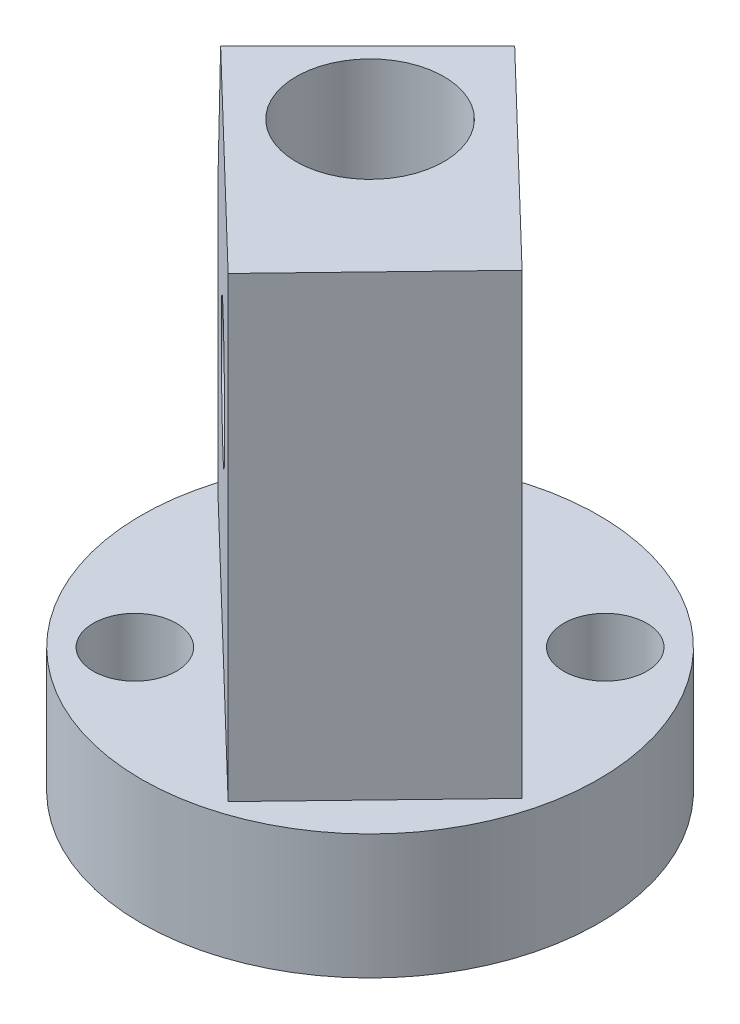
ISO-10303-21;
HEADER;
FILE_DESCRIPTION(('STEP AP214'),'2;1');
FILE_NAME('part.step','',(''),(''),'','','');
FILE_SCHEMA(('AUTOMOTIVE_DESIGN { 1 0 10303 214 1 1 1 1 }'));
ENDSEC;
DATA;
#1=APPLICATION_CONTEXT('core data for automotive mechanical design processes');
#2=APPLICATION_PROTOCOL_DEFINITION('international standard','automotive_design',2000,#1);
#3=PRODUCT_CONTEXT('',#1,'mechanical');
#4=PRODUCT('Part','Part','',(#3));
#5=PRODUCT_RELATED_PRODUCT_CATEGORY('part','',(#4));
#6=PRODUCT_DEFINITION_FORMATION('','',#4);
#7=PRODUCT_DEFINITION_CONTEXT('part definition',#1,'design');
#8=PRODUCT_DEFINITION('design','',#6,#7);
#9=PRODUCT_DEFINITION_SHAPE('','',#8);
#10=(LENGTH_UNIT() NAMED_UNIT(*) SI_UNIT(.MILLI.,.METRE.));
#11=(NAMED_UNIT(*) PLANE_ANGLE_UNIT() SI_UNIT($,.RADIAN.));
#12=(NAMED_UNIT(*) SI_UNIT($,.STERADIAN.) SOLID_ANGLE_UNIT());
#13=UNCERTAINTY_MEASURE_WITH_UNIT(LENGTH_MEASURE(1.E-05),#10,'distance_accuracy_value','');
#14=(GEOMETRIC_REPRESENTATION_CONTEXT(3) GLOBAL_UNCERTAINTY_ASSIGNED_CONTEXT((#13)) GLOBAL_UNIT_ASSIGNED_CONTEXT((#10,
#11,#12)) REPRESENTATION_CONTEXT('',''));
#15=CARTESIAN_POINT('',(0.,0.,0.));
#16=DIRECTION('',(0.,0.,1.));
#17=DIRECTION('',(1.,0.,0.));
#18=AXIS2_PLACEMENT_3D('',#15,#16,#17);
#19=CARTESIAN_POINT('',(9.95156463020634,6.,2.63938655956761));
#20=DIRECTION('',(-0.720444800698294,0.,-0.69351228478434));
#21=DIRECTION('',(-0.69351228478434,0.,0.720444800698294));
#22=AXIS2_PLACEMENT_3D('',#19,#20,#21);
#23=PLANE('',#22);
#24=DIRECTION('',(0.69351228478434,0.,-0.720444800698294));
#25=VECTOR('',#24,1.);
#26=CARTESIAN_POINT('',(6.48400320628464,28.,6.24161056305907));
#27=LINE('',#26,#25);
#28=CARTESIAN_POINT('',(3.01644178236294,28.,9.84383456655053));
#29=VERTEX_POINT('',#28);
#30=CARTESIAN_POINT('',(9.95156463020634,28.,2.63938655956761));
#31=VERTEX_POINT('',#30);
#32=EDGE_CURVE('E10',#29,#31,#27,.T.);
#33=ORIENTED_EDGE('',*,*,#32,.F.);
#34=DIRECTION('',(0.,1.,0.));
#35=VECTOR('',#34,1.);
#36=CARTESIAN_POINT('',(3.01644178236294,17.,9.84383456655053));
#37=LINE('',#36,#35);
#38=CARTESIAN_POINT('',(3.01644178236294,6.,9.84383456655053));
#39=VERTEX_POINT('',#38);
#40=EDGE_CURVE('E26',#39,#29,#37,.T.);
#41=ORIENTED_EDGE('',*,*,#40,.F.);
#42=DIRECTION('',(0.69351228478434,0.,-0.720444800698294));
#43=VECTOR('',#42,1.);
#44=CARTESIAN_POINT('',(6.48400320628464,6.,6.24161056305907));
#45=LINE('',#44,#43);
#46=CARTESIAN_POINT('',(9.95156463020635,6.,2.6393865595676));
#47=VERTEX_POINT('',#46);
#48=EDGE_CURVE('E127',#39,#47,#45,.T.);
#49=ORIENTED_EDGE('',*,*,#48,.T.);
#50=DIRECTION('',(0.,1.,0.));
#51=VECTOR('',#50,1.);
#52=CARTESIAN_POINT('',(9.95156463020634,17.,2.63938655956761));
#53=LINE('',#52,#51);
#54=EDGE_CURVE('E35',#47,#31,#53,.T.);
#55=ORIENTED_EDGE('',*,*,#54,.T.);
#56=EDGE_LOOP('',(#33,#41,#49,#55));
#57=FACE_BOUND('',#56,.T.);
#58=ADVANCED_FACE('F16',(#57),#23,.F.);
#59=CARTESIAN_POINT('',(0.,3.,0.));
#60=DIRECTION('',(0.,1.,0.));
#61=DIRECTION('',(0.,0.,1.));
#62=AXIS2_PLACEMENT_3D('',#59,#60,#61);
#63=CYLINDRICAL_SURFACE('',#62,11.);
#64=CARTESIAN_POINT('',(0.,6.,0.));
#65=DIRECTION('',(0.,1.,0.));
#66=DIRECTION('',(0.,0.,1.));
#67=AXIS2_PLACEMENT_3D('',#64,#65,#66);
#68=CIRCLE('',#67,11.);
#69=CARTESIAN_POINT('',(0.,6.,11.));
#70=VERTEX_POINT('',#69);
#71=EDGE_CURVE('E150',#70,#70,#68,.T.);
#72=ORIENTED_EDGE('',*,*,#71,.F.);
#73=EDGE_LOOP('',(#72));
#74=FACE_BOUND('',#73,.T.);
#75=CARTESIAN_POINT('',(0.,0.,0.));
#76=DIRECTION('',(0.,1.,0.));
#77=DIRECTION('',(0.,0.,1.));
#78=AXIS2_PLACEMENT_3D('',#75,#76,#77);
#79=CIRCLE('',#78,11.);
#80=CARTESIAN_POINT('',(0.,0.,11.));
#81=VERTEX_POINT('',#80);
#82=EDGE_CURVE('E143',#81,#81,#79,.T.);
#83=ORIENTED_EDGE('',*,*,#82,.T.);
#84=EDGE_LOOP('',(#83));
#85=FACE_BOUND('',#84,.T.);
#86=ADVANCED_FACE('F178',(#74,#85),#63,.T.);
#87=CARTESIAN_POINT('',(0.,0.,0.));
#88=DIRECTION('',(0.,1.,0.));
#89=DIRECTION('',(0.,0.,1.));
#90=AXIS2_PLACEMENT_3D('',#87,#88,#89);
#91=PLANE('',#90);
#92=ORIENTED_EDGE('',*,*,#82,.F.);
#93=EDGE_LOOP('',(#92));
#94=FACE_BOUND('',#93,.T.);
#95=CARTESIAN_POINT('',(-5.65685424949238,0.,5.65685424949238));
#96=DIRECTION('',(0.,1.,0.));
#97=DIRECTION('',(0.,0.,1.));
#98=AXIS2_PLACEMENT_3D('',#95,#96,#97);
#99=CIRCLE('',#98,1.25);
#100=CARTESIAN_POINT('',(-5.65685424949238,0.,6.90685424949238));
#101=VERTEX_POINT('',#100);
#102=EDGE_CURVE('E131',#101,#101,#99,.T.);
#103=ORIENTED_EDGE('',*,*,#102,.T.);
#104=EDGE_LOOP('',(#103));
#105=FACE_BOUND('',#104,.T.);
#106=CARTESIAN_POINT('',(5.65685424949238,0.,-5.65685424949238));
#107=DIRECTION('',(0.,1.,0.));
#108=DIRECTION('',(0.,0.,1.));
#109=AXIS2_PLACEMENT_3D('',#106,#107,#108);
#110=CIRCLE('',#109,1.25);
#111=CARTESIAN_POINT('',(5.65685424949238,0.,-4.40685424949238));
#112=VERTEX_POINT('',#111);
#113=EDGE_CURVE('E140',#112,#112,#110,.T.);
#114=ORIENTED_EDGE('',*,*,#113,.T.);
#115=EDGE_LOOP('',(#114));
#116=FACE_BOUND('',#115,.T.);
#117=CARTESIAN_POINT('',(0.,0.,0.));
#118=DIRECTION('',(0.,1.,0.));
#119=DIRECTION('',(0.,0.,1.));
#120=AXIS2_PLACEMENT_3D('',#117,#118,#119);
#121=CIRCLE('',#120,4.);
#122=CARTESIAN_POINT('',(0.,0.,4.));
#123=VERTEX_POINT('',#122);
#124=EDGE_CURVE('E139',#123,#123,#121,.T.);
#125=ORIENTED_EDGE('',*,*,#124,.T.);
#126=EDGE_LOOP('',(#125));
#127=FACE_BOUND('',#126,.T.);
#128=ADVANCED_FACE('F183',(#94,#105,#116,#127),#91,.F.);
#129=CARTESIAN_POINT('',(0.,3.,0.));
#130=DIRECTION('',(0.,1.,0.));
#131=DIRECTION('',(0.,0.,1.));
#132=AXIS2_PLACEMENT_3D('',#129,#130,#131);
#133=CYLINDRICAL_SURFACE('',#132,4.);
#134=CARTESIAN_POINT('',(0.,2.,0.));
#135=DIRECTION('',(0.,-1.,0.));
#136=DIRECTION('',(0.,0.,1.));
#137=AXIS2_PLACEMENT_3D('',#134,#135,#136);
#138=CIRCLE('',#137,4.);
#139=CARTESIAN_POINT('',(0.,2.,4.));
#140=VERTEX_POINT('',#139);
#141=EDGE_CURVE('E136',#140,#140,#138,.T.);
#142=ORIENTED_EDGE('',*,*,#141,.F.);
#143=EDGE_LOOP('',(#142));
#144=FACE_BOUND('',#143,.T.);
#145=ORIENTED_EDGE('',*,*,#124,.F.);
#146=EDGE_LOOP('',(#145));
#147=FACE_BOUND('',#146,.T.);
#148=ADVANCED_FACE('F189',(#144,#147),#133,.F.);
#149=CARTESIAN_POINT('',(0.,6.,0.));
#150=DIRECTION('',(0.,-1.,0.));
#151=DIRECTION('',(0.,0.,-1.));
#152=AXIS2_PLACEMENT_3D('',#149,#150,#151);
#153=CONICAL_SURFACE('',#152,0.,0.785398163397448);
#154=CARTESIAN_POINT('',(0.,6.,0.));
#155=VERTEX_POINT('',#154);
#156=VERTEX_LOOP('',#155);
#157=FACE_BOUND('',#156,.T.);
#158=ORIENTED_EDGE('',*,*,#141,.T.);
#159=EDGE_LOOP('',(#158));
#160=FACE_BOUND('',#159,.T.);
#161=ADVANCED_FACE('F193',(#157,#160),#153,.F.);
#162=CARTESIAN_POINT('',(5.65685424949238,3.,-5.65685424949238));
#163=DIRECTION('',(0.,1.,0.));
#164=DIRECTION('',(0.,0.,1.));
#165=AXIS2_PLACEMENT_3D('',#162,#163,#164);
#166=CYLINDRICAL_SURFACE('',#165,1.25);
#167=CARTESIAN_POINT('',(5.65685424949238,1.5,-5.65685424949238));
#168=DIRECTION('',(0.,1.,0.));
#169=DIRECTION('',(0.,0.,1.));
#170=AXIS2_PLACEMENT_3D('',#167,#168,#169);
#171=CIRCLE('',#170,1.25);
#172=CARTESIAN_POINT('',(5.65685424949238,1.5,-4.40685424949238));
#173=VERTEX_POINT('',#172);
#174=EDGE_CURVE('E109',#173,#173,#171,.T.);
#175=ORIENTED_EDGE('',*,*,#174,.T.);
#176=EDGE_LOOP('',(#175));
#177=FACE_BOUND('',#176,.T.);
#178=ORIENTED_EDGE('',*,*,#113,.F.);
#179=EDGE_LOOP('',(#178));
#180=FACE_BOUND('',#179,.T.);
#181=ADVANCED_FACE('F197',(#177,#180),#166,.F.);
#182=CARTESIAN_POINT('',(-5.65685424949238,3.,5.65685424949238));
#183=DIRECTION('',(0.,1.,0.));
#184=DIRECTION('',(0.,0.,1.));
#185=AXIS2_PLACEMENT_3D('',#182,#183,#184);
#186=CYLINDRICAL_SURFACE('',#185,1.25);
#187=CARTESIAN_POINT('',(-5.65685424949238,1.5,5.65685424949238));
#188=DIRECTION('',(0.,1.,0.));
#189=DIRECTION('',(0.,0.,1.));
#190=AXIS2_PLACEMENT_3D('',#187,#188,#189);
#191=CIRCLE('',#190,1.25);
#192=CARTESIAN_POINT('',(-5.65685424949238,1.5,6.90685424949238));
#193=VERTEX_POINT('',#192);
#194=EDGE_CURVE('E113',#193,#193,#191,.T.);
#195=ORIENTED_EDGE('',*,*,#194,.T.);
#196=EDGE_LOOP('',(#195));
#197=FACE_BOUND('',#196,.T.);
#198=ORIENTED_EDGE('',*,*,#102,.F.);
#199=EDGE_LOOP('',(#198));
#200=FACE_BOUND('',#199,.T.);
#201=ADVANCED_FACE('F201',(#197,#200),#186,.F.);
#202=CARTESIAN_POINT('',(0.,6.,0.));
#203=DIRECTION('',(0.,1.,0.));
#204=DIRECTION('',(0.,0.,1.));
#205=AXIS2_PLACEMENT_3D('',#202,#203,#204);
#206=PLANE('',#205);
#207=ORIENTED_EDGE('',*,*,#71,.T.);
#208=EDGE_LOOP('',(#207));
#209=FACE_BOUND('',#208,.T.);
#210=DIRECTION('',(0.720444800698293,0.,0.693512284784341));
#211=VECTOR('',#210,1.);
#212=CARTESIAN_POINT('',(-3.5361752144644,6.,3.53617521446439));
#213=LINE('',#212,#211);
#214=CARTESIAN_POINT('',(-10.0887922112917,6.,-2.77148413762175));
#215=VERTEX_POINT('',#214);
#216=EDGE_CURVE('E128',#215,#39,#213,.T.);
#217=ORIENTED_EDGE('',*,*,#216,.F.);
#218=DIRECTION('',(-0.707106781186547,0.,0.707106781186548));
#219=VECTOR('',#218,1.);
#220=CARTESIAN_POINT('',(-6.55261699682733,6.,-6.30765935208614));
#221=LINE('',#220,#219);
#222=CARTESIAN_POINT('',(-3.01644178236293,6.,-9.84383456655054));
#223=VERTEX_POINT('',#222);
#224=EDGE_CURVE('E123',#223,#215,#221,.T.);
#225=ORIENTED_EDGE('',*,*,#224,.F.);
#226=DIRECTION('',(-0.720444800698293,0.,-0.693512284784341));
#227=VECTOR('',#226,1.);
#228=CARTESIAN_POINT('',(3.4675614239217,6.,-3.60222400349146));
#229=LINE('',#228,#227);
#230=EDGE_CURVE('E125',#47,#223,#229,.T.);
#231=ORIENTED_EDGE('',*,*,#230,.F.);
#232=ORIENTED_EDGE('',*,*,#48,.F.);
#233=EDGE_LOOP('',(#217,#225,#231,#232));
#234=FACE_BOUND('',#233,.T.);
#235=CARTESIAN_POINT('',(-5.65685424949238,6.,5.65685424949238));
#236=DIRECTION('',(0.,1.,0.));
#237=DIRECTION('',(0.,0.,1.));
#238=AXIS2_PLACEMENT_3D('',#235,#236,#237);
#239=CIRCLE('',#238,2.);
#240=CARTESIAN_POINT('',(-5.65685424949238,6.,7.65685424949238));
#241=VERTEX_POINT('',#240);
#242=EDGE_CURVE('E120',#241,#241,#239,.T.);
#243=ORIENTED_EDGE('',*,*,#242,.F.);
#244=EDGE_LOOP('',(#243));
#245=FACE_BOUND('',#244,.T.);
#246=CARTESIAN_POINT('',(5.65685424949238,6.,-5.65685424949238));
#247=DIRECTION('',(0.,1.,0.));
#248=DIRECTION('',(0.,0.,1.));
#249=AXIS2_PLACEMENT_3D('',#246,#247,#248);
#250=CIRCLE('',#249,2.);
#251=CARTESIAN_POINT('',(5.65685424949238,6.,-3.65685424949238));
#252=VERTEX_POINT('',#251);
#253=EDGE_CURVE('E117',#252,#252,#250,.T.);
#254=ORIENTED_EDGE('',*,*,#253,.F.);
#255=EDGE_LOOP('',(#254));
#256=FACE_BOUND('',#255,.T.);
#257=ADVANCED_FACE('F159',(#209,#234,#245,#256),#206,.T.);
#258=CARTESIAN_POINT('',(-5.65685424949238,3.75,5.65685424949238));
#259=DIRECTION('',(0.,1.,0.));
#260=DIRECTION('',(0.,0.,1.));
#261=AXIS2_PLACEMENT_3D('',#258,#259,#260);
#262=CYLINDRICAL_SURFACE('',#261,2.);
#263=CARTESIAN_POINT('',(-5.65685424949238,1.5,5.65685424949238));
#264=DIRECTION('',(0.,1.,0.));
#265=DIRECTION('',(0.,0.,1.));
#266=AXIS2_PLACEMENT_3D('',#263,#264,#265);
#267=CIRCLE('',#266,2.);
#268=CARTESIAN_POINT('',(-5.65685424949238,1.5,7.65685424949238));
#269=VERTEX_POINT('',#268);
#270=EDGE_CURVE('E114',#269,#269,#267,.T.);
#271=ORIENTED_EDGE('',*,*,#270,.F.);
#272=EDGE_LOOP('',(#271));
#273=FACE_BOUND('',#272,.T.);
#274=ORIENTED_EDGE('',*,*,#242,.T.);
#275=EDGE_LOOP('',(#274));
#276=FACE_BOUND('',#275,.T.);
#277=ADVANCED_FACE('F208',(#273,#276),#262,.F.);
#278=CARTESIAN_POINT('',(0.,1.5,0.));
#279=DIRECTION('',(0.,1.,0.));
#280=DIRECTION('',(0.,0.,1.));
#281=AXIS2_PLACEMENT_3D('',#278,#279,#280);
#282=PLANE('',#281);
#283=ORIENTED_EDGE('',*,*,#270,.T.);
#284=EDGE_LOOP('',(#283));
#285=FACE_BOUND('',#284,.T.);
#286=ORIENTED_EDGE('',*,*,#194,.F.);
#287=EDGE_LOOP('',(#286));
#288=FACE_BOUND('',#287,.T.);
#289=ADVANCED_FACE('F212',(#285,#288),#282,.T.);
#290=CARTESIAN_POINT('',(5.65685424949238,3.75,-5.65685424949238));
#291=DIRECTION('',(0.,1.,0.));
#292=DIRECTION('',(0.,0.,1.));
#293=AXIS2_PLACEMENT_3D('',#290,#291,#292);
#294=CYLINDRICAL_SURFACE('',#293,2.);
#295=CARTESIAN_POINT('',(5.65685424949238,1.5,-5.65685424949238));
#296=DIRECTION('',(0.,1.,0.));
#297=DIRECTION('',(0.,0.,1.));
#298=AXIS2_PLACEMENT_3D('',#295,#296,#297);
#299=CIRCLE('',#298,2.);
#300=CARTESIAN_POINT('',(5.65685424949238,1.5,-3.65685424949238));
#301=VERTEX_POINT('',#300);
#302=EDGE_CURVE('E110',#301,#301,#299,.T.);
#303=ORIENTED_EDGE('',*,*,#302,.F.);
#304=EDGE_LOOP('',(#303));
#305=FACE_BOUND('',#304,.T.);
#306=ORIENTED_EDGE('',*,*,#253,.T.);
#307=EDGE_LOOP('',(#306));
#308=FACE_BOUND('',#307,.T.);
#309=ADVANCED_FACE('F216',(#305,#308),#294,.F.);
#310=CARTESIAN_POINT('',(0.,1.5,0.));
#311=DIRECTION('',(0.,1.,0.));
#312=DIRECTION('',(0.,0.,1.));
#313=AXIS2_PLACEMENT_3D('',#310,#311,#312);
#314=PLANE('',#313);
#315=ORIENTED_EDGE('',*,*,#302,.T.);
#316=EDGE_LOOP('',(#315));
#317=FACE_BOUND('',#316,.T.);
#318=ORIENTED_EDGE('',*,*,#174,.F.);
#319=EDGE_LOOP('',(#318));
#320=FACE_BOUND('',#319,.T.);
#321=ADVANCED_FACE('F220',(#317,#320),#314,.T.);
#322=CARTESIAN_POINT('',(-0.137227581085378,17.,-0.132097578054152));
#323=DIRECTION('',(-0.693512284784341,0.,0.720444800698293));
#324=DIRECTION('',(0.720444800698293,0.,0.693512284784341));
#325=AXIS2_PLACEMENT_3D('',#322,#323,#324);
#326=CYLINDRICAL_SURFACE('',#325,3.);
#327=CARTESIAN_POINT('',(3.33033384283633,17.,-3.73432158154562));
#328=DIRECTION('',(-0.693512284784341,0.,0.720444800698293));
#329=DIRECTION('',(0.720444800698293,0.,0.693512284784341));
#330=AXIS2_PLACEMENT_3D('',#327,#328,#329);
#331=CIRCLE('',#330,3.);
#332=CARTESIAN_POINT('',(5.49166824493121,17.,-1.6537847271926));
#333=VERTEX_POINT('',#332);
#334=EDGE_CURVE('E106',#333,#333,#331,.T.);
#335=ORIENTED_EDGE('',*,*,#334,.F.);
#336=EDGE_LOOP('',(#335));
#337=FACE_BOUND('',#336,.T.);
#338=CARTESIAN_POINT('',(-3.60478900500708,17.,3.47012642543732));
#339=DIRECTION('',(-0.693512284784341,0.,0.720444800698293));
#340=DIRECTION('',(0.720444800698293,0.,0.693512284784341));
#341=AXIS2_PLACEMENT_3D('',#338,#339,#340);
#342=CIRCLE('',#341,3.);
#343=CARTESIAN_POINT('',(-1.4434546029122,17.,5.55066327979034));
#344=VERTEX_POINT('',#343);
#345=EDGE_CURVE('E100',#344,#344,#342,.T.);
#346=ORIENTED_EDGE('',*,*,#345,.T.);
#347=EDGE_LOOP('',(#346));
#348=FACE_BOUND('',#347,.T.);
#349=ADVANCED_FACE('F224',(#337,#348),#326,.F.);
#350=CARTESIAN_POINT('',(0.,25.,0.));
#351=DIRECTION('',(0.,1.,0.));
#352=DIRECTION('',(0.,0.,1.));
#353=AXIS2_PLACEMENT_3D('',#350,#351,#352);
#354=CYLINDRICAL_SURFACE('',#353,3.55);
#355=CARTESIAN_POINT('',(0.,22.,0.));
#356=DIRECTION('',(0.,1.,0.));
#357=DIRECTION('',(0.,0.,1.));
#358=AXIS2_PLACEMENT_3D('',#355,#356,#357);
#359=CIRCLE('',#358,3.55);
#360=CARTESIAN_POINT('',(0.,22.,3.55));
#361=VERTEX_POINT('',#360);
#362=EDGE_CURVE('E91',#361,#361,#359,.T.);
#363=ORIENTED_EDGE('',*,*,#362,.F.);
#364=EDGE_LOOP('',(#363));
#365=FACE_BOUND('',#364,.T.);
#366=CARTESIAN_POINT('',(0.,28.,0.));
#367=DIRECTION('',(0.,1.,0.));
#368=DIRECTION('',(0.,0.,1.));
#369=AXIS2_PLACEMENT_3D('',#366,#367,#368);
#370=CIRCLE('',#369,3.55);
#371=CARTESIAN_POINT('',(0.,28.,3.55));
#372=VERTEX_POINT('',#371);
#373=EDGE_CURVE('E78',#372,#372,#370,.T.);
#374=ORIENTED_EDGE('',*,*,#373,.T.);
#375=EDGE_LOOP('',(#374));
#376=FACE_BOUND('',#375,.T.);
#377=ADVANCED_FACE('F228',(#365,#376),#354,.F.);
#378=CARTESIAN_POINT('',(0.,22.,0.));
#379=DIRECTION('',(0.,1.,0.));
#380=DIRECTION('',(0.,0.,1.));
#381=AXIS2_PLACEMENT_3D('',#378,#379,#380);
#382=PLANE('',#381);
#383=ORIENTED_EDGE('',*,*,#362,.T.);
#384=EDGE_LOOP('',(#383));
#385=FACE_BOUND('',#384,.T.);
#386=ADVANCED_FACE('F175',(#385),#382,.T.);
#387=CARTESIAN_POINT('',(-10.0887922112917,6.,-2.77148413762175));
#388=DIRECTION('',(0.707106781186548,0.,0.707106781186547));
#389=DIRECTION('',(0.707106781186547,0.,-0.707106781186548));
#390=AXIS2_PLACEMENT_3D('',#387,#388,#389);
#391=PLANE('',#390);
#392=DIRECTION('',(0.,1.,0.));
#393=VECTOR('',#392,1.);
#394=CARTESIAN_POINT('',(-10.0887922112917,12.5,-2.77148413762175));
#395=LINE('',#394,#393);
#396=CARTESIAN_POINT('',(-10.0887922112917,19.,-2.77148413762175));
#397=VERTEX_POINT('',#396);
#398=EDGE_CURVE('E93',#215,#397,#395,.T.);
#399=ORIENTED_EDGE('',*,*,#398,.T.);
#400=DIRECTION('',(-0.707106781186547,0.,0.707106781186548));
#401=VECTOR('',#400,1.);
#402=CARTESIAN_POINT('',(-6.55261699682733,19.,-6.30765935208614));
#403=LINE('',#402,#401);
#404=CARTESIAN_POINT('',(-3.01644178236294,19.,-9.84383456655053));
#405=VERTEX_POINT('',#404);
#406=EDGE_CURVE('E97',#405,#397,#403,.T.);
#407=ORIENTED_EDGE('',*,*,#406,.F.);
#408=DIRECTION('',(0.,1.,0.));
#409=VECTOR('',#408,1.);
#410=CARTESIAN_POINT('',(-3.01644178236293,12.5,-9.84383456655054));
#411=LINE('',#410,#409);
#412=EDGE_CURVE('E77',#223,#405,#411,.T.);
#413=ORIENTED_EDGE('',*,*,#412,.F.);
#414=ORIENTED_EDGE('',*,*,#224,.T.);
#415=EDGE_LOOP('',(#399,#407,#413,#414));
#416=FACE_BOUND('',#415,.T.);
#417=ADVANCED_FACE('F162',(#416),#391,.F.);
#418=CARTESIAN_POINT('',(3.01644178236293,6.,9.84383456655053));
#419=DIRECTION('',(0.693512284784341,0.,-0.720444800698293));
#420=DIRECTION('',(-0.720444800698293,0.,-0.693512284784341));
#421=AXIS2_PLACEMENT_3D('',#418,#419,#420);
#422=PLANE('',#421);
#423=DIRECTION('',(0.720444800698293,0.,0.693512284784341));
#424=VECTOR('',#423,1.);
#425=CARTESIAN_POINT('',(-1.81205970497403,28.,5.19583780771212));
#426=LINE('',#425,#424);
#427=CARTESIAN_POINT('',(-6.640561192311,28.,0.547841048873719));
#428=VERTEX_POINT('',#427);
#429=EDGE_CURVE('E95',#428,#29,#426,.T.);
#430=ORIENTED_EDGE('',*,*,#429,.F.);
#431=DIRECTION('',(0.338276172678979,0.88291229252115,0.32563033444799));
#432=VECTOR('',#431,1.);
#433=CARTESIAN_POINT('',(-8.36467670180136,23.5,-1.11182154437401));
#434=LINE('',#433,#432);
#435=EDGE_CURVE('E63',#397,#428,#434,.T.);
#436=ORIENTED_EDGE('',*,*,#435,.F.);
#437=ORIENTED_EDGE('',*,*,#398,.F.);
#438=ORIENTED_EDGE('',*,*,#216,.T.);
#439=ORIENTED_EDGE('',*,*,#40,.T.);
#440=EDGE_LOOP('',(#430,#436,#437,#438,#439));
#441=FACE_BOUND('',#440,.T.);
#442=ORIENTED_EDGE('',*,*,#345,.F.);
#443=EDGE_LOOP('',(#442));
#444=FACE_BOUND('',#443,.T.);
#445=ADVANCED_FACE('F165',(#441,#444),#422,.F.);
#446=CARTESIAN_POINT('',(-3.01644178236294,6.,-9.84383456655053));
#447=DIRECTION('',(-0.693512284784341,0.,0.720444800698293));
#448=DIRECTION('',(0.720444800698293,0.,0.693512284784341));
#449=AXIS2_PLACEMENT_3D('',#446,#447,#448);
#450=PLANE('',#449);
#451=ORIENTED_EDGE('',*,*,#412,.T.);
#452=DIRECTION('',(-0.338276172678978,-0.88291229252115,-0.32563033444799));
#453=VECTOR('',#452,1.);
#454=CARTESIAN_POINT('',(-1.29232627287258,23.5,-8.1841719733028));
#455=LINE('',#454,#453);
#456=CARTESIAN_POINT('',(0.431789236617777,28.,-6.52450938005507));
#457=VERTEX_POINT('',#456);
#458=EDGE_CURVE('E70',#457,#405,#455,.T.);
#459=ORIENTED_EDGE('',*,*,#458,.F.);
#460=DIRECTION('',(-0.720444800698293,0.,-0.693512284784341));
#461=VECTOR('',#460,1.);
#462=CARTESIAN_POINT('',(5.19167693341206,28.,-1.94256141024373));
#463=LINE('',#462,#461);
#464=EDGE_CURVE('E74',#31,#457,#463,.T.);
#465=ORIENTED_EDGE('',*,*,#464,.F.);
#466=ORIENTED_EDGE('',*,*,#54,.F.);
#467=ORIENTED_EDGE('',*,*,#230,.T.);
#468=EDGE_LOOP('',(#451,#459,#465,#466,#467));
#469=FACE_BOUND('',#468,.T.);
#470=ORIENTED_EDGE('',*,*,#334,.T.);
#471=EDGE_LOOP('',(#470));
#472=FACE_BOUND('',#471,.T.);
#473=ADVANCED_FACE('F72',(#469,#472),#450,.F.);
#474=CARTESIAN_POINT('',(0.,28.,0.));
#475=DIRECTION('',(0.,1.,0.));
#476=DIRECTION('',(0.,0.,1.));
#477=AXIS2_PLACEMENT_3D('',#474,#475,#476);
#478=PLANE('',#477);
#479=DIRECTION('',(-0.707106781186547,0.,0.707106781186548));
#480=VECTOR('',#479,1.);
#481=CARTESIAN_POINT('',(-3.10438597784661,28.,-2.98833416559067));
#482=LINE('',#481,#480);
#483=EDGE_CURVE('E20',#457,#428,#482,.T.);
#484=ORIENTED_EDGE('',*,*,#483,.T.);
#485=ORIENTED_EDGE('',*,*,#429,.T.);
#486=ORIENTED_EDGE('',*,*,#32,.T.);
#487=ORIENTED_EDGE('',*,*,#464,.T.);
#488=EDGE_LOOP('',(#484,#485,#486,#487));
#489=FACE_BOUND('',#488,.T.);
#490=ORIENTED_EDGE('',*,*,#373,.F.);
#491=EDGE_LOOP('',(#490));
#492=FACE_BOUND('',#491,.T.);
#493=ADVANCED_FACE('F81',(#489,#492),#478,.T.);
#494=CARTESIAN_POINT('',(4.30487014699537,19.,-17.1651464959088));
#495=DIRECTION('',(-0.624338230342886,0.469471562785891,-0.624338230342886));
#496=DIRECTION('',(-0.707106781186548,0.,0.707106781186548));
#497=AXIS2_PLACEMENT_3D('',#494,#495,#496);
#498=PLANE('',#497);
#499=ORIENTED_EDGE('',*,*,#406,.T.);
#500=ORIENTED_EDGE('',*,*,#435,.T.);
#501=ORIENTED_EDGE('',*,*,#483,.F.);
#502=ORIENTED_EDGE('',*,*,#458,.T.);
#503=EDGE_LOOP('',(#499,#500,#501,#502));
#504=FACE_BOUND('',#503,.T.);
#505=ADVANCED_FACE('F18',(#504),#498,.T.);
#506=CLOSED_SHELL('',(#58,#86,#128,#148,#161,#181,#201,#257,#277,#289,#309,#321,#349,#377,#386,
#417,#445,#473,#493,#505));
#507=MANIFOLD_SOLID_BREP('B1',#506);
#508=ADVANCED_BREP_SHAPE_REPRESENTATION('',(#18,#507),#14);
#509=SHAPE_DEFINITION_REPRESENTATION(#9,#508);
ENDSEC;
END-ISO-10303-21;
